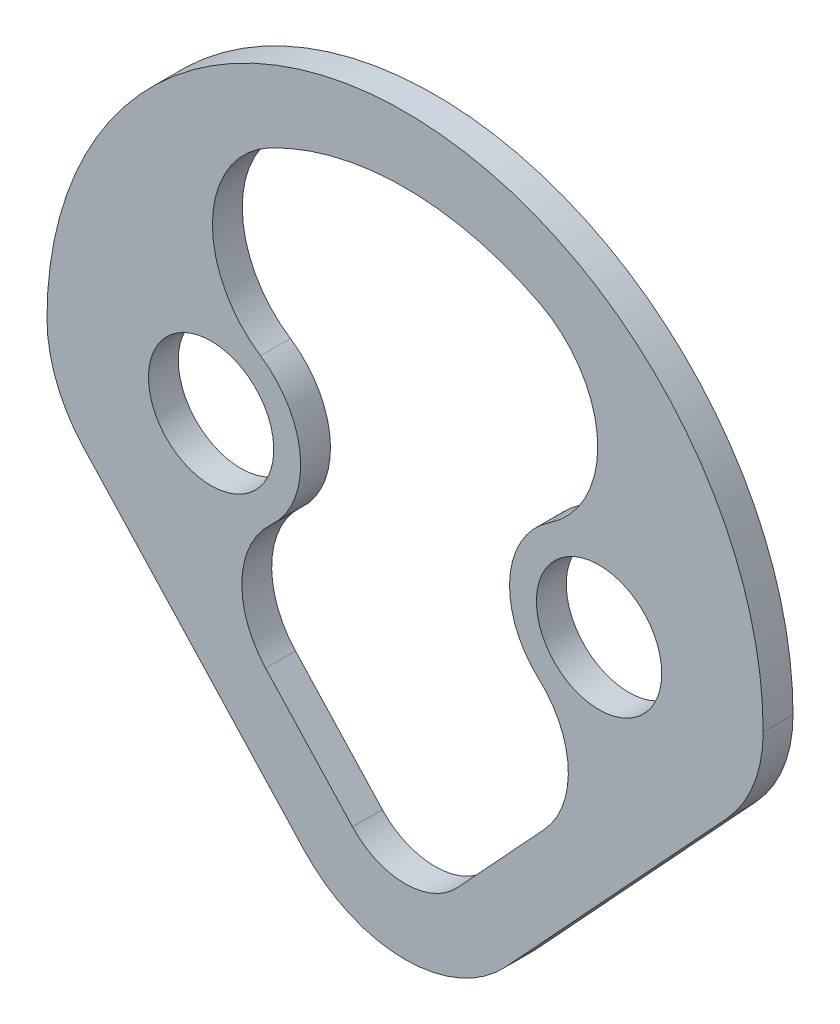
ISO-10303-21;
HEADER;
FILE_DESCRIPTION(('STEP AP214'),'2;1');
FILE_NAME('part.step','',(''),(''),'','','');
FILE_SCHEMA(('AUTOMOTIVE_DESIGN { 1 0 10303 214 1 1 1 1 }'));
ENDSEC;
DATA;
#1=APPLICATION_CONTEXT('core data for automotive mechanical design processes');
#2=APPLICATION_PROTOCOL_DEFINITION('international standard','automotive_design',2000,#1);
#3=PRODUCT_CONTEXT('',#1,'mechanical');
#4=PRODUCT('Part','Part','',(#3));
#5=PRODUCT_RELATED_PRODUCT_CATEGORY('part','',(#4));
#6=PRODUCT_DEFINITION_FORMATION('','',#4);
#7=PRODUCT_DEFINITION_CONTEXT('part definition',#1,'design');
#8=PRODUCT_DEFINITION('design','',#6,#7);
#9=PRODUCT_DEFINITION_SHAPE('','',#8);
#10=(LENGTH_UNIT() NAMED_UNIT(*) SI_UNIT(.MILLI.,.METRE.));
#11=(NAMED_UNIT(*) PLANE_ANGLE_UNIT() SI_UNIT($,.RADIAN.));
#12=(NAMED_UNIT(*) SI_UNIT($,.STERADIAN.) SOLID_ANGLE_UNIT());
#13=UNCERTAINTY_MEASURE_WITH_UNIT(LENGTH_MEASURE(1.E-05),#10,'distance_accuracy_value','');
#14=(GEOMETRIC_REPRESENTATION_CONTEXT(3) GLOBAL_UNCERTAINTY_ASSIGNED_CONTEXT((#13)) GLOBAL_UNIT_ASSIGNED_CONTEXT((#10,
#11,#12)) REPRESENTATION_CONTEXT('',''));
#15=CARTESIAN_POINT('',(0.,0.,0.));
#16=DIRECTION('',(0.,0.,1.));
#17=DIRECTION('',(1.,0.,0.));
#18=AXIS2_PLACEMENT_3D('',#15,#16,#17);
#19=CARTESIAN_POINT('',(0.,0.,5.));
#20=DIRECTION('',(0.,0.,1.));
#21=DIRECTION('',(1.,0.,0.));
#22=AXIS2_PLACEMENT_3D('',#19,#20,#21);
#23=PLANE('',#22);
#24=CARTESIAN_POINT('',(32.5,40.,5.));
#25=DIRECTION('',(0.,0.,1.));
#26=DIRECTION('',(1.,0.,0.));
#27=AXIS2_PLACEMENT_3D('',#24,#25,#26);
#28=CIRCLE('',#27,10.5);
#29=CARTESIAN_POINT('',(43.,40.,5.));
#30=VERTEX_POINT('',#29);
#31=EDGE_CURVE('E191',#30,#30,#28,.T.);
#32=ORIENTED_EDGE('',*,*,#31,.F.);
#33=EDGE_LOOP('',(#32));
#34=FACE_BOUND('',#33,.T.);
#35=CARTESIAN_POINT('',(0.,0.,5.));
#36=DIRECTION('',(0.,0.,1.));
#37=DIRECTION('',(1.,0.,0.));
#38=AXIS2_PLACEMENT_3D('',#35,#36,#37);
#39=CIRCLE('',#38,23.);
#40=CARTESIAN_POINT('',(-16.8842871104874,-15.6179655772008,5.));
#41=VERTEX_POINT('',#40);
#42=CARTESIAN_POINT('',(16.8842871104874,-15.6179655772008,5.));
#43=VERTEX_POINT('',#42);
#44=EDGE_CURVE('E233',#41,#43,#39,.T.);
#45=ORIENTED_EDGE('',*,*,#44,.T.);
#46=DIRECTION('',(0.679041981617427,0.734099439586408,0.));
#47=VECTOR('',#46,1.);
#48=CARTESIAN_POINT('',(53.8842871104874,24.3820344227992,5.));
#49=LINE('',#48,#47);
#50=CARTESIAN_POINT('',(53.8842871104874,24.3820344227992,5.));
#51=VERTEX_POINT('',#50);
#52=EDGE_CURVE('E240',#43,#51,#49,.T.);
#53=ORIENTED_EDGE('',*,*,#52,.T.);
#54=CARTESIAN_POINT('',(37.,40.,5.));
#55=DIRECTION('',(0.,0.,1.));
#56=DIRECTION('',(-1.,0.,0.));
#57=AXIS2_PLACEMENT_3D('',#54,#55,#56);
#58=CIRCLE('',#57,23.);
#59=CARTESIAN_POINT('',(60.,40.,5.));
#60=VERTEX_POINT('',#59);
#61=EDGE_CURVE('E238',#51,#60,#58,.T.);
#62=ORIENTED_EDGE('',*,*,#61,.T.);
#63=CARTESIAN_POINT('',(0.,40.,5.));
#64=DIRECTION('',(0.,0.,1.));
#65=DIRECTION('',(-1.,0.,0.));
#66=AXIS2_PLACEMENT_3D('',#63,#64,#65);
#67=CIRCLE('',#66,60.);
#68=CARTESIAN_POINT('',(-60.,40.,5.));
#69=VERTEX_POINT('',#68);
#70=EDGE_CURVE('E242',#60,#69,#67,.T.);
#71=ORIENTED_EDGE('',*,*,#70,.T.);
#72=CARTESIAN_POINT('',(-37.,40.,5.));
#73=DIRECTION('',(0.,0.,1.));
#74=DIRECTION('',(1.,0.,0.));
#75=AXIS2_PLACEMENT_3D('',#72,#73,#74);
#76=CIRCLE('',#75,23.);
#77=CARTESIAN_POINT('',(-53.8842871104874,24.3820344227992,5.));
#78=VERTEX_POINT('',#77);
#79=EDGE_CURVE('E243',#69,#78,#76,.T.);
#80=ORIENTED_EDGE('',*,*,#79,.T.);
#81=DIRECTION('',(0.679041981617427,-0.734099439586408,0.));
#82=VECTOR('',#81,1.);
#83=CARTESIAN_POINT('',(-53.8842871104874,24.3820344227992,5.));
#84=LINE('',#83,#82);
#85=EDGE_CURVE('E247',#78,#41,#84,.T.);
#86=ORIENTED_EDGE('',*,*,#85,.T.);
#87=EDGE_LOOP('',(#45,#53,#62,#71,#80,#86));
#88=FACE_BOUND('',#87,.T.);
#89=CARTESIAN_POINT('',(32.5,40.,5.));
#90=DIRECTION('',(0.,0.,-1.));
#91=DIRECTION('',(1.,0.,0.));
#92=AXIS2_PLACEMENT_3D('',#89,#90,#91);
#93=CIRCLE('',#92,15.);
#94=CARTESIAN_POINT('',(22.4262716545417,28.8860449334222,5.));
#95=VERTEX_POINT('',#94);
#96=CARTESIAN_POINT('',(24.2185314685315,52.5066893685858,5.));
#97=VERTEX_POINT('',#96);
#98=EDGE_CURVE('E158',#95,#97,#93,.T.);
#99=ORIENTED_EDGE('',*,*,#98,.F.);
#100=CARTESIAN_POINT('',(12.3525433090835,17.7720898668444,5.));
#101=DIRECTION('',(0.,0.,1.));
#102=DIRECTION('',(1.,0.,0.));
#103=AXIS2_PLACEMENT_3D('',#100,#101,#102);
#104=CIRCLE('',#103,15.);
#105=CARTESIAN_POINT('',(23.3640349028796,7.58646014258298,5.));
#106=VERTEX_POINT('',#105);
#107=EDGE_CURVE('E152',#106,#95,#104,.T.);
#108=ORIENTED_EDGE('',*,*,#107,.F.);
#109=DIRECTION('',(0.679041981617427,0.734099439586408,0.));
#110=VECTOR('',#109,1.);
#111=CARTESIAN_POINT('',(8.8091932750369,-8.14850377940912,5.));
#112=LINE('',#111,#110);
#113=CARTESIAN_POINT('',(8.8091932750369,-8.14850377940912,5.));
#114=VERTEX_POINT('',#113);
#115=EDGE_CURVE('E192',#114,#106,#112,.T.);
#116=ORIENTED_EDGE('',*,*,#115,.F.);
#117=CARTESIAN_POINT('',(0.,0.,5.));
#118=DIRECTION('',(0.,0.,1.));
#119=DIRECTION('',(1.,0.,0.));
#120=AXIS2_PLACEMENT_3D('',#117,#118,#119);
#121=CIRCLE('',#120,12.);
#122=CARTESIAN_POINT('',(-8.8091932750369,-8.14850377940912,5.));
#123=VERTEX_POINT('',#122);
#124=EDGE_CURVE('E188',#123,#114,#121,.T.);
#125=ORIENTED_EDGE('',*,*,#124,.F.);
#126=DIRECTION('',(0.679041981617427,-0.734099439586408,0.));
#127=VECTOR('',#126,1.);
#128=CARTESIAN_POINT('',(-8.8091932750369,-8.14850377940912,5.));
#129=LINE('',#128,#127);
#130=CARTESIAN_POINT('',(-23.3640349028796,7.58646014258298,5.));
#131=VERTEX_POINT('',#130);
#132=EDGE_CURVE('E190',#131,#123,#129,.T.);
#133=ORIENTED_EDGE('',*,*,#132,.F.);
#134=CARTESIAN_POINT('',(-12.3525433090835,17.7720898668444,5.));
#135=DIRECTION('',(0.,0.,1.));
#136=DIRECTION('',(-1.,0.,0.));
#137=AXIS2_PLACEMENT_3D('',#134,#135,#136);
#138=CIRCLE('',#137,15.);
#139=CARTESIAN_POINT('',(-22.4262716545417,28.8860449334222,5.));
#140=VERTEX_POINT('',#139);
#141=EDGE_CURVE('E184',#140,#131,#138,.T.);
#142=ORIENTED_EDGE('',*,*,#141,.F.);
#143=CARTESIAN_POINT('',(-32.5,40.,5.));
#144=DIRECTION('',(0.,0.,-1.));
#145=DIRECTION('',(-1.,0.,0.));
#146=AXIS2_PLACEMENT_3D('',#143,#144,#145);
#147=CIRCLE('',#146,15.);
#148=CARTESIAN_POINT('',(-24.2185314685315,52.5066893685858,5.));
#149=VERTEX_POINT('',#148);
#150=EDGE_CURVE('E183',#149,#140,#147,.T.);
#151=ORIENTED_EDGE('',*,*,#150,.F.);
#152=CARTESIAN_POINT('',(-14.2807692307692,67.5147166108887,5.));
#153=DIRECTION('',(0.,0.,1.));
#154=DIRECTION('',(1.,0.,0.));
#155=AXIS2_PLACEMENT_3D('',#152,#153,#154);
#156=CIRCLE('',#155,18.);
#157=CARTESIAN_POINT('',(-22.5728287841191,83.4910036752757,5.));
#158=VERTEX_POINT('',#157);
#159=EDGE_CURVE('E181',#158,#149,#156,.T.);
#160=ORIENTED_EDGE('',*,*,#159,.F.);
#161=CARTESIAN_POINT('',(0.,40.,5.));
#162=DIRECTION('',(0.,0.,1.));
#163=DIRECTION('',(-1.,0.,0.));
#164=AXIS2_PLACEMENT_3D('',#161,#162,#163);
#165=CIRCLE('',#164,49.);
#166=CARTESIAN_POINT('',(22.5728287841191,83.4910036752757,5.));
#167=VERTEX_POINT('',#166);
#168=EDGE_CURVE('E176',#167,#158,#165,.T.);
#169=ORIENTED_EDGE('',*,*,#168,.F.);
#170=CARTESIAN_POINT('',(14.2807692307692,67.5147166108887,5.));
#171=DIRECTION('',(0.,0.,1.));
#172=DIRECTION('',(-1.,0.,0.));
#173=AXIS2_PLACEMENT_3D('',#170,#171,#172);
#174=CIRCLE('',#173,18.);
#175=EDGE_CURVE('E174',#97,#167,#174,.T.);
#176=ORIENTED_EDGE('',*,*,#175,.F.);
#177=EDGE_LOOP('',(#99,#108,#116,#125,#133,#142,#151,#160,#169,#176));
#178=FACE_BOUND('',#177,.T.);
#179=CARTESIAN_POINT('',(-32.5,40.,5.));
#180=DIRECTION('',(0.,0.,1.));
#181=DIRECTION('',(-1.,0.,0.));
#182=AXIS2_PLACEMENT_3D('',#179,#180,#181);
#183=CIRCLE('',#182,10.5);
#184=CARTESIAN_POINT('',(-43.,40.,5.));
#185=VERTEX_POINT('',#184);
#186=EDGE_CURVE('E362',#185,#185,#183,.T.);
#187=ORIENTED_EDGE('',*,*,#186,.F.);
#188=EDGE_LOOP('',(#187));
#189=FACE_BOUND('',#188,.T.);
#190=ADVANCED_FACE('F39',(#34,#88,#178,#189),#23,.T.);
#191=CARTESIAN_POINT('',(0.,0.,0.));
#192=DIRECTION('',(0.,0.,1.));
#193=DIRECTION('',(1.,0.,0.));
#194=AXIS2_PLACEMENT_3D('',#191,#192,#193);
#195=PLANE('',#194);
#196=CARTESIAN_POINT('',(0.,0.,0.));
#197=DIRECTION('',(0.,0.,1.));
#198=DIRECTION('',(1.,0.,0.));
#199=AXIS2_PLACEMENT_3D('',#196,#197,#198);
#200=CIRCLE('',#199,23.);
#201=CARTESIAN_POINT('',(-16.8842871104874,-15.6179655772008,0.));
#202=VERTEX_POINT('',#201);
#203=CARTESIAN_POINT('',(16.8842871104874,-15.6179655772008,0.));
#204=VERTEX_POINT('',#203);
#205=EDGE_CURVE('E166',#202,#204,#200,.T.);
#206=ORIENTED_EDGE('',*,*,#205,.F.);
#207=DIRECTION('',(0.679041981617427,-0.734099439586408,0.));
#208=VECTOR('',#207,1.);
#209=CARTESIAN_POINT('',(-53.8842871104874,24.3820344227992,0.));
#210=LINE('',#209,#208);
#211=CARTESIAN_POINT('',(-53.8842871104874,24.3820344227992,0.));
#212=VERTEX_POINT('',#211);
#213=EDGE_CURVE('E239',#212,#202,#210,.T.);
#214=ORIENTED_EDGE('',*,*,#213,.F.);
#215=CARTESIAN_POINT('',(-37.,40.,0.));
#216=DIRECTION('',(0.,0.,1.));
#217=DIRECTION('',(1.,0.,0.));
#218=AXIS2_PLACEMENT_3D('',#215,#216,#217);
#219=CIRCLE('',#218,23.);
#220=CARTESIAN_POINT('',(-60.,40.,0.));
#221=VERTEX_POINT('',#220);
#222=EDGE_CURVE('E257',#221,#212,#219,.T.);
#223=ORIENTED_EDGE('',*,*,#222,.F.);
#224=CARTESIAN_POINT('',(0.,40.,0.));
#225=DIRECTION('',(0.,0.,1.));
#226=DIRECTION('',(-1.,0.,0.));
#227=AXIS2_PLACEMENT_3D('',#224,#225,#226);
#228=CIRCLE('',#227,60.);
#229=CARTESIAN_POINT('',(60.,40.,0.));
#230=VERTEX_POINT('',#229);
#231=EDGE_CURVE('E255',#230,#221,#228,.T.);
#232=ORIENTED_EDGE('',*,*,#231,.F.);
#233=CARTESIAN_POINT('',(37.,40.,0.));
#234=DIRECTION('',(0.,0.,1.));
#235=DIRECTION('',(-1.,0.,0.));
#236=AXIS2_PLACEMENT_3D('',#233,#234,#235);
#237=CIRCLE('',#236,23.);
#238=CARTESIAN_POINT('',(53.8842871104874,24.3820344227992,0.));
#239=VERTEX_POINT('',#238);
#240=EDGE_CURVE('E254',#239,#230,#237,.T.);
#241=ORIENTED_EDGE('',*,*,#240,.F.);
#242=DIRECTION('',(0.679041981617427,0.734099439586408,0.));
#243=VECTOR('',#242,1.);
#244=CARTESIAN_POINT('',(53.8842871104874,24.3820344227992,0.));
#245=LINE('',#244,#243);
#246=EDGE_CURVE('E251',#204,#239,#245,.T.);
#247=ORIENTED_EDGE('',*,*,#246,.F.);
#248=EDGE_LOOP('',(#206,#214,#223,#232,#241,#247));
#249=FACE_BOUND('',#248,.T.);
#250=CARTESIAN_POINT('',(12.3525433090835,17.7720898668444,0.));
#251=DIRECTION('',(0.,0.,1.));
#252=DIRECTION('',(1.,0.,0.));
#253=AXIS2_PLACEMENT_3D('',#250,#251,#252);
#254=CIRCLE('',#253,15.);
#255=CARTESIAN_POINT('',(23.3640349028796,7.58646014258298,0.));
#256=VERTEX_POINT('',#255);
#257=CARTESIAN_POINT('',(22.4262716545417,28.8860449334222,0.));
#258=VERTEX_POINT('',#257);
#259=EDGE_CURVE('E62',#256,#258,#254,.T.);
#260=ORIENTED_EDGE('',*,*,#259,.T.);
#261=CARTESIAN_POINT('',(32.5,40.,0.));
#262=DIRECTION('',(0.,0.,-1.));
#263=DIRECTION('',(1.,0.,0.));
#264=AXIS2_PLACEMENT_3D('',#261,#262,#263);
#265=CIRCLE('',#264,15.);
#266=CARTESIAN_POINT('',(24.2185314685315,52.5066893685858,0.));
#267=VERTEX_POINT('',#266);
#268=EDGE_CURVE('E167',#258,#267,#265,.T.);
#269=ORIENTED_EDGE('',*,*,#268,.T.);
#270=CARTESIAN_POINT('',(14.2807692307692,67.5147166108887,0.));
#271=DIRECTION('',(0.,0.,1.));
#272=DIRECTION('',(-1.,0.,0.));
#273=AXIS2_PLACEMENT_3D('',#270,#271,#272);
#274=CIRCLE('',#273,18.);
#275=CARTESIAN_POINT('',(22.5728287841191,83.4910036752757,0.));
#276=VERTEX_POINT('',#275);
#277=EDGE_CURVE('E196',#267,#276,#274,.T.);
#278=ORIENTED_EDGE('',*,*,#277,.T.);
#279=CARTESIAN_POINT('',(0.,40.,0.));
#280=DIRECTION('',(0.,0.,1.));
#281=DIRECTION('',(-1.,0.,0.));
#282=AXIS2_PLACEMENT_3D('',#279,#280,#281);
#283=CIRCLE('',#282,49.);
#284=CARTESIAN_POINT('',(-22.5728287841191,83.4910036752757,0.));
#285=VERTEX_POINT('',#284);
#286=EDGE_CURVE('E198',#276,#285,#283,.T.);
#287=ORIENTED_EDGE('',*,*,#286,.T.);
#288=CARTESIAN_POINT('',(-14.2807692307692,67.5147166108887,0.));
#289=DIRECTION('',(0.,0.,1.));
#290=DIRECTION('',(1.,0.,0.));
#291=AXIS2_PLACEMENT_3D('',#288,#289,#290);
#292=CIRCLE('',#291,18.);
#293=CARTESIAN_POINT('',(-24.2185314685315,52.5066893685858,0.));
#294=VERTEX_POINT('',#293);
#295=EDGE_CURVE('E205',#285,#294,#292,.T.);
#296=ORIENTED_EDGE('',*,*,#295,.T.);
#297=CARTESIAN_POINT('',(-32.5,40.,0.));
#298=DIRECTION('',(0.,0.,-1.));
#299=DIRECTION('',(-1.,0.,0.));
#300=AXIS2_PLACEMENT_3D('',#297,#298,#299);
#301=CIRCLE('',#300,15.);
#302=CARTESIAN_POINT('',(-22.4262716545417,28.8860449334222,0.));
#303=VERTEX_POINT('',#302);
#304=EDGE_CURVE('E203',#294,#303,#301,.T.);
#305=ORIENTED_EDGE('',*,*,#304,.T.);
#306=CARTESIAN_POINT('',(-12.3525433090835,17.7720898668444,0.));
#307=DIRECTION('',(0.,0.,1.));
#308=DIRECTION('',(-1.,0.,0.));
#309=AXIS2_PLACEMENT_3D('',#306,#307,#308);
#310=CIRCLE('',#309,15.);
#311=CARTESIAN_POINT('',(-23.3640349028796,7.58646014258298,0.));
#312=VERTEX_POINT('',#311);
#313=EDGE_CURVE('E209',#303,#312,#310,.T.);
#314=ORIENTED_EDGE('',*,*,#313,.T.);
#315=DIRECTION('',(0.679041981617427,-0.734099439586408,0.));
#316=VECTOR('',#315,1.);
#317=CARTESIAN_POINT('',(-8.8091932750369,-8.14850377940912,0.));
#318=LINE('',#317,#316);
#319=CARTESIAN_POINT('',(-8.8091932750369,-8.14850377940912,0.));
#320=VERTEX_POINT('',#319);
#321=EDGE_CURVE('E213',#312,#320,#318,.T.);
#322=ORIENTED_EDGE('',*,*,#321,.T.);
#323=CARTESIAN_POINT('',(0.,0.,0.));
#324=DIRECTION('',(0.,0.,1.));
#325=DIRECTION('',(1.,0.,0.));
#326=AXIS2_PLACEMENT_3D('',#323,#324,#325);
#327=CIRCLE('',#326,12.);
#328=CARTESIAN_POINT('',(8.8091932750369,-8.14850377940912,0.));
#329=VERTEX_POINT('',#328);
#330=EDGE_CURVE('E215',#320,#329,#327,.T.);
#331=ORIENTED_EDGE('',*,*,#330,.T.);
#332=DIRECTION('',(0.679041981617427,0.734099439586408,0.));
#333=VECTOR('',#332,1.);
#334=CARTESIAN_POINT('',(8.8091932750369,-8.14850377940912,0.));
#335=LINE('',#334,#333);
#336=EDGE_CURVE('E161',#329,#256,#335,.T.);
#337=ORIENTED_EDGE('',*,*,#336,.T.);
#338=EDGE_LOOP('',(#260,#269,#278,#287,#296,#305,#314,#322,#331,#337));
#339=FACE_BOUND('',#338,.T.);
#340=CARTESIAN_POINT('',(32.5,40.,0.));
#341=DIRECTION('',(0.,0.,1.));
#342=DIRECTION('',(1.,0.,0.));
#343=AXIS2_PLACEMENT_3D('',#340,#341,#342);
#344=CIRCLE('',#343,10.5);
#345=CARTESIAN_POINT('',(43.,40.,0.));
#346=VERTEX_POINT('',#345);
#347=EDGE_CURVE('E369',#346,#346,#344,.T.);
#348=ORIENTED_EDGE('',*,*,#347,.T.);
#349=EDGE_LOOP('',(#348));
#350=FACE_BOUND('',#349,.T.);
#351=CARTESIAN_POINT('',(-32.5,40.,0.));
#352=DIRECTION('',(0.,0.,1.));
#353=DIRECTION('',(-1.,0.,0.));
#354=AXIS2_PLACEMENT_3D('',#351,#352,#353);
#355=CIRCLE('',#354,10.5);
#356=CARTESIAN_POINT('',(-43.,40.,0.));
#357=VERTEX_POINT('',#356);
#358=EDGE_CURVE('E370',#357,#357,#355,.T.);
#359=ORIENTED_EDGE('',*,*,#358,.T.);
#360=EDGE_LOOP('',(#359));
#361=FACE_BOUND('',#360,.T.);
#362=ADVANCED_FACE('F282',(#249,#339,#350,#361),#195,.F.);
#363=CARTESIAN_POINT('',(0.,0.,5.));
#364=DIRECTION('',(0.,0.,-1.));
#365=DIRECTION('',(-1.,0.,0.));
#366=AXIS2_PLACEMENT_3D('',#363,#364,#365);
#367=CYLINDRICAL_SURFACE('',#366,23.);
#368=ORIENTED_EDGE('',*,*,#205,.T.);
#369=DIRECTION('',(0.,0.,-1.));
#370=VECTOR('',#369,1.);
#371=CARTESIAN_POINT('',(16.8842871104874,-15.6179655772008,5.));
#372=LINE('',#371,#370);
#373=EDGE_CURVE('E11',#43,#204,#372,.T.);
#374=ORIENTED_EDGE('',*,*,#373,.F.);
#375=ORIENTED_EDGE('',*,*,#44,.F.);
#376=DIRECTION('',(0.,0.,-1.));
#377=VECTOR('',#376,1.);
#378=CARTESIAN_POINT('',(-16.8842871104874,-15.6179655772008,5.));
#379=LINE('',#378,#377);
#380=EDGE_CURVE('E246',#41,#202,#379,.T.);
#381=ORIENTED_EDGE('',*,*,#380,.T.);
#382=EDGE_LOOP('',(#368,#374,#375,#381));
#383=FACE_BOUND('',#382,.T.);
#384=ADVANCED_FACE('F41',(#383),#367,.T.);
#385=CARTESIAN_POINT('',(53.8842871104874,24.3820344227992,5.));
#386=DIRECTION('',(-0.734099439586408,0.679041981617427,0.));
#387=DIRECTION('',(-0.679041981617427,-0.734099439586408,0.));
#388=AXIS2_PLACEMENT_3D('',#385,#386,#387);
#389=PLANE('',#388);
#390=ORIENTED_EDGE('',*,*,#246,.T.);
#391=DIRECTION('',(0.,0.,-1.));
#392=VECTOR('',#391,1.);
#393=CARTESIAN_POINT('',(53.8842871104874,24.3820344227992,5.));
#394=LINE('',#393,#392);
#395=EDGE_CURVE('E50',#51,#239,#394,.T.);
#396=ORIENTED_EDGE('',*,*,#395,.F.);
#397=ORIENTED_EDGE('',*,*,#52,.F.);
#398=ORIENTED_EDGE('',*,*,#373,.T.);
#399=EDGE_LOOP('',(#390,#396,#397,#398));
#400=FACE_BOUND('',#399,.T.);
#401=ADVANCED_FACE('F299',(#400),#389,.F.);
#402=CARTESIAN_POINT('',(37.,40.,5.));
#403=DIRECTION('',(0.,0.,-1.));
#404=DIRECTION('',(-1.,0.,0.));
#405=AXIS2_PLACEMENT_3D('',#402,#403,#404);
#406=CYLINDRICAL_SURFACE('',#405,23.);
#407=ORIENTED_EDGE('',*,*,#240,.T.);
#408=DIRECTION('',(0.,0.,-1.));
#409=VECTOR('',#408,1.);
#410=CARTESIAN_POINT('',(60.,40.,5.));
#411=LINE('',#410,#409);
#412=EDGE_CURVE('E268',#60,#230,#411,.T.);
#413=ORIENTED_EDGE('',*,*,#412,.F.);
#414=ORIENTED_EDGE('',*,*,#61,.F.);
#415=ORIENTED_EDGE('',*,*,#395,.T.);
#416=EDGE_LOOP('',(#407,#413,#414,#415));
#417=FACE_BOUND('',#416,.T.);
#418=ADVANCED_FACE('F274',(#417),#406,.T.);
#419=CARTESIAN_POINT('',(0.,40.,5.));
#420=DIRECTION('',(0.,0.,-1.));
#421=DIRECTION('',(-1.,0.,0.));
#422=AXIS2_PLACEMENT_3D('',#419,#420,#421);
#423=CYLINDRICAL_SURFACE('',#422,60.);
#424=ORIENTED_EDGE('',*,*,#231,.T.);
#425=DIRECTION('',(0.,0.,-1.));
#426=VECTOR('',#425,1.);
#427=CARTESIAN_POINT('',(-60.,40.,5.));
#428=LINE('',#427,#426);
#429=EDGE_CURVE('E262',#69,#221,#428,.T.);
#430=ORIENTED_EDGE('',*,*,#429,.F.);
#431=ORIENTED_EDGE('',*,*,#70,.F.);
#432=ORIENTED_EDGE('',*,*,#412,.T.);
#433=EDGE_LOOP('',(#424,#430,#431,#432));
#434=FACE_BOUND('',#433,.T.);
#435=ADVANCED_FACE('F287',(#434),#423,.T.);
#436=CARTESIAN_POINT('',(-37.,40.,5.));
#437=DIRECTION('',(0.,0.,-1.));
#438=DIRECTION('',(-1.,0.,0.));
#439=AXIS2_PLACEMENT_3D('',#436,#437,#438);
#440=CYLINDRICAL_SURFACE('',#439,23.);
#441=ORIENTED_EDGE('',*,*,#222,.T.);
#442=DIRECTION('',(0.,0.,-1.));
#443=VECTOR('',#442,1.);
#444=CARTESIAN_POINT('',(-53.8842871104874,24.3820344227992,5.));
#445=LINE('',#444,#443);
#446=EDGE_CURVE('E265',#78,#212,#445,.T.);
#447=ORIENTED_EDGE('',*,*,#446,.F.);
#448=ORIENTED_EDGE('',*,*,#79,.F.);
#449=ORIENTED_EDGE('',*,*,#429,.T.);
#450=EDGE_LOOP('',(#441,#447,#448,#449));
#451=FACE_BOUND('',#450,.T.);
#452=ADVANCED_FACE('F292',(#451),#440,.T.);
#453=CARTESIAN_POINT('',(-53.8842871104874,24.3820344227992,5.));
#454=DIRECTION('',(0.734099439586408,0.679041981617427,0.));
#455=DIRECTION('',(-0.679041981617427,0.734099439586408,0.));
#456=AXIS2_PLACEMENT_3D('',#453,#454,#455);
#457=PLANE('',#456);
#458=ORIENTED_EDGE('',*,*,#213,.T.);
#459=ORIENTED_EDGE('',*,*,#380,.F.);
#460=ORIENTED_EDGE('',*,*,#85,.F.);
#461=ORIENTED_EDGE('',*,*,#446,.T.);
#462=EDGE_LOOP('',(#458,#459,#460,#461));
#463=FACE_BOUND('',#462,.T.);
#464=ADVANCED_FACE('F303',(#463),#457,.F.);
#465=CARTESIAN_POINT('',(12.3525433090835,17.7720898668444,5.));
#466=DIRECTION('',(0.,0.,-1.));
#467=DIRECTION('',(-1.,0.,0.));
#468=AXIS2_PLACEMENT_3D('',#465,#466,#467);
#469=CYLINDRICAL_SURFACE('',#468,15.);
#470=ORIENTED_EDGE('',*,*,#259,.F.);
#471=DIRECTION('',(0.,0.,-1.));
#472=VECTOR('',#471,1.);
#473=CARTESIAN_POINT('',(23.3640349028796,7.58646014258298,5.));
#474=LINE('',#473,#472);
#475=EDGE_CURVE('E157',#106,#256,#474,.T.);
#476=ORIENTED_EDGE('',*,*,#475,.F.);
#477=ORIENTED_EDGE('',*,*,#107,.T.);
#478=DIRECTION('',(0.,0.,-1.));
#479=VECTOR('',#478,1.);
#480=CARTESIAN_POINT('',(22.4262716545417,28.8860449334222,5.));
#481=LINE('',#480,#479);
#482=EDGE_CURVE('E155',#95,#258,#481,.T.);
#483=ORIENTED_EDGE('',*,*,#482,.T.);
#484=EDGE_LOOP('',(#470,#476,#477,#483));
#485=FACE_BOUND('',#484,.T.);
#486=ADVANCED_FACE('F153',(#485),#469,.F.);
#487=CARTESIAN_POINT('',(32.5,40.,5.));
#488=DIRECTION('',(0.,0.,-1.));
#489=DIRECTION('',(-1.,0.,0.));
#490=AXIS2_PLACEMENT_3D('',#487,#488,#489);
#491=CYLINDRICAL_SURFACE('',#490,15.);
#492=ORIENTED_EDGE('',*,*,#268,.F.);
#493=ORIENTED_EDGE('',*,*,#482,.F.);
#494=ORIENTED_EDGE('',*,*,#98,.T.);
#495=DIRECTION('',(0.,0.,-1.));
#496=VECTOR('',#495,1.);
#497=CARTESIAN_POINT('',(24.2185314685315,52.5066893685858,5.));
#498=LINE('',#497,#496);
#499=EDGE_CURVE('E170',#97,#267,#498,.T.);
#500=ORIENTED_EDGE('',*,*,#499,.T.);
#501=EDGE_LOOP('',(#492,#493,#494,#500));
#502=FACE_BOUND('',#501,.T.);
#503=ADVANCED_FACE('F163',(#502),#491,.T.);
#504=CARTESIAN_POINT('',(14.2807692307692,67.5147166108887,5.));
#505=DIRECTION('',(0.,0.,-1.));
#506=DIRECTION('',(-1.,0.,0.));
#507=AXIS2_PLACEMENT_3D('',#504,#505,#506);
#508=CYLINDRICAL_SURFACE('',#507,18.);
#509=ORIENTED_EDGE('',*,*,#277,.F.);
#510=ORIENTED_EDGE('',*,*,#499,.F.);
#511=ORIENTED_EDGE('',*,*,#175,.T.);
#512=DIRECTION('',(0.,0.,-1.));
#513=VECTOR('',#512,1.);
#514=CARTESIAN_POINT('',(22.5728287841191,83.4910036752757,5.));
#515=LINE('',#514,#513);
#516=EDGE_CURVE('E231',#167,#276,#515,.T.);
#517=ORIENTED_EDGE('',*,*,#516,.T.);
#518=EDGE_LOOP('',(#509,#510,#511,#517));
#519=FACE_BOUND('',#518,.T.);
#520=ADVANCED_FACE('F321',(#519),#508,.F.);
#521=CARTESIAN_POINT('',(0.,40.,5.));
#522=DIRECTION('',(0.,0.,-1.));
#523=DIRECTION('',(-1.,0.,0.));
#524=AXIS2_PLACEMENT_3D('',#521,#522,#523);
#525=CYLINDRICAL_SURFACE('',#524,49.);
#526=ORIENTED_EDGE('',*,*,#286,.F.);
#527=ORIENTED_EDGE('',*,*,#516,.F.);
#528=ORIENTED_EDGE('',*,*,#168,.T.);
#529=DIRECTION('',(0.,0.,-1.));
#530=VECTOR('',#529,1.);
#531=CARTESIAN_POINT('',(-22.5728287841191,83.4910036752757,5.));
#532=LINE('',#531,#530);
#533=EDGE_CURVE('E227',#158,#285,#532,.T.);
#534=ORIENTED_EDGE('',*,*,#533,.T.);
#535=EDGE_LOOP('',(#526,#527,#528,#534));
#536=FACE_BOUND('',#535,.T.);
#537=ADVANCED_FACE('F323',(#536),#525,.F.);
#538=CARTESIAN_POINT('',(-14.2807692307692,67.5147166108887,5.));
#539=DIRECTION('',(0.,0.,-1.));
#540=DIRECTION('',(-1.,0.,0.));
#541=AXIS2_PLACEMENT_3D('',#538,#539,#540);
#542=CYLINDRICAL_SURFACE('',#541,18.);
#543=ORIENTED_EDGE('',*,*,#295,.F.);
#544=ORIENTED_EDGE('',*,*,#533,.F.);
#545=ORIENTED_EDGE('',*,*,#159,.T.);
#546=DIRECTION('',(0.,0.,-1.));
#547=VECTOR('',#546,1.);
#548=CARTESIAN_POINT('',(-24.2185314685315,52.5066893685858,5.));
#549=LINE('',#548,#547);
#550=EDGE_CURVE('E230',#149,#294,#549,.T.);
#551=ORIENTED_EDGE('',*,*,#550,.T.);
#552=EDGE_LOOP('',(#543,#544,#545,#551));
#553=FACE_BOUND('',#552,.T.);
#554=ADVANCED_FACE('F329',(#553),#542,.F.);
#555=CARTESIAN_POINT('',(-32.5,40.,5.));
#556=DIRECTION('',(0.,0.,-1.));
#557=DIRECTION('',(-1.,0.,0.));
#558=AXIS2_PLACEMENT_3D('',#555,#556,#557);
#559=CYLINDRICAL_SURFACE('',#558,15.);
#560=ORIENTED_EDGE('',*,*,#304,.F.);
#561=ORIENTED_EDGE('',*,*,#550,.F.);
#562=ORIENTED_EDGE('',*,*,#150,.T.);
#563=DIRECTION('',(0.,0.,-1.));
#564=VECTOR('',#563,1.);
#565=CARTESIAN_POINT('',(-22.4262716545417,28.8860449334222,5.));
#566=LINE('',#565,#564);
#567=EDGE_CURVE('E224',#140,#303,#566,.T.);
#568=ORIENTED_EDGE('',*,*,#567,.T.);
#569=EDGE_LOOP('',(#560,#561,#562,#568));
#570=FACE_BOUND('',#569,.T.);
#571=ADVANCED_FACE('F332',(#570),#559,.T.);
#572=CARTESIAN_POINT('',(-12.3525433090835,17.7720898668444,5.));
#573=DIRECTION('',(0.,0.,-1.));
#574=DIRECTION('',(-1.,0.,0.));
#575=AXIS2_PLACEMENT_3D('',#572,#573,#574);
#576=CYLINDRICAL_SURFACE('',#575,15.);
#577=ORIENTED_EDGE('',*,*,#313,.F.);
#578=ORIENTED_EDGE('',*,*,#567,.F.);
#579=ORIENTED_EDGE('',*,*,#141,.T.);
#580=DIRECTION('',(0.,0.,-1.));
#581=VECTOR('',#580,1.);
#582=CARTESIAN_POINT('',(-23.3640349028796,7.58646014258298,5.));
#583=LINE('',#582,#581);
#584=EDGE_CURVE('E223',#131,#312,#583,.T.);
#585=ORIENTED_EDGE('',*,*,#584,.T.);
#586=EDGE_LOOP('',(#577,#578,#579,#585));
#587=FACE_BOUND('',#586,.T.);
#588=ADVANCED_FACE('F337',(#587),#576,.F.);
#589=CARTESIAN_POINT('',(-8.8091932750369,-8.14850377940912,5.));
#590=DIRECTION('',(0.734099439586408,0.679041981617427,0.));
#591=DIRECTION('',(-0.679041981617427,0.734099439586408,0.));
#592=AXIS2_PLACEMENT_3D('',#589,#590,#591);
#593=PLANE('',#592);
#594=ORIENTED_EDGE('',*,*,#321,.F.);
#595=ORIENTED_EDGE('',*,*,#584,.F.);
#596=ORIENTED_EDGE('',*,*,#132,.T.);
#597=DIRECTION('',(0.,0.,-1.));
#598=VECTOR('',#597,1.);
#599=CARTESIAN_POINT('',(-8.8091932750369,-8.14850377940912,5.));
#600=LINE('',#599,#598);
#601=EDGE_CURVE('E221',#123,#320,#600,.T.);
#602=ORIENTED_EDGE('',*,*,#601,.T.);
#603=EDGE_LOOP('',(#594,#595,#596,#602));
#604=FACE_BOUND('',#603,.T.);
#605=ADVANCED_FACE('F338',(#604),#593,.T.);
#606=CARTESIAN_POINT('',(0.,0.,5.));
#607=DIRECTION('',(0.,0.,-1.));
#608=DIRECTION('',(-1.,0.,0.));
#609=AXIS2_PLACEMENT_3D('',#606,#607,#608);
#610=CYLINDRICAL_SURFACE('',#609,12.);
#611=ORIENTED_EDGE('',*,*,#330,.F.);
#612=ORIENTED_EDGE('',*,*,#601,.F.);
#613=ORIENTED_EDGE('',*,*,#124,.T.);
#614=DIRECTION('',(0.,0.,-1.));
#615=VECTOR('',#614,1.);
#616=CARTESIAN_POINT('',(8.8091932750369,-8.14850377940912,5.));
#617=LINE('',#616,#615);
#618=EDGE_CURVE('E53',#114,#329,#617,.T.);
#619=ORIENTED_EDGE('',*,*,#618,.T.);
#620=EDGE_LOOP('',(#611,#612,#613,#619));
#621=FACE_BOUND('',#620,.T.);
#622=ADVANCED_FACE('F343',(#621),#610,.F.);
#623=CARTESIAN_POINT('',(8.8091932750369,-8.14850377940912,5.));
#624=DIRECTION('',(-0.734099439586408,0.679041981617427,0.));
#625=DIRECTION('',(-0.679041981617427,-0.734099439586408,0.));
#626=AXIS2_PLACEMENT_3D('',#623,#624,#625);
#627=PLANE('',#626);
#628=ORIENTED_EDGE('',*,*,#336,.F.);
#629=ORIENTED_EDGE('',*,*,#618,.F.);
#630=ORIENTED_EDGE('',*,*,#115,.T.);
#631=ORIENTED_EDGE('',*,*,#475,.T.);
#632=EDGE_LOOP('',(#628,#629,#630,#631));
#633=FACE_BOUND('',#632,.T.);
#634=ADVANCED_FACE('F346',(#633),#627,.T.);
#635=CARTESIAN_POINT('',(32.5,40.,5.));
#636=DIRECTION('',(0.,0.,-1.));
#637=DIRECTION('',(-1.,0.,0.));
#638=AXIS2_PLACEMENT_3D('',#635,#636,#637);
#639=CYLINDRICAL_SURFACE('',#638,10.5);
#640=ORIENTED_EDGE('',*,*,#31,.T.);
#641=EDGE_LOOP('',(#640));
#642=FACE_BOUND('',#641,.T.);
#643=ORIENTED_EDGE('',*,*,#347,.F.);
#644=EDGE_LOOP('',(#643));
#645=FACE_BOUND('',#644,.T.);
#646=ADVANCED_FACE('F355',(#642,#645),#639,.F.);
#647=CARTESIAN_POINT('',(-32.5,40.,5.));
#648=DIRECTION('',(0.,0.,-1.));
#649=DIRECTION('',(-1.,0.,0.));
#650=AXIS2_PLACEMENT_3D('',#647,#648,#649);
#651=CYLINDRICAL_SURFACE('',#650,10.5);
#652=ORIENTED_EDGE('',*,*,#186,.T.);
#653=EDGE_LOOP('',(#652));
#654=FACE_BOUND('',#653,.T.);
#655=ORIENTED_EDGE('',*,*,#358,.F.);
#656=EDGE_LOOP('',(#655));
#657=FACE_BOUND('',#656,.T.);
#658=ADVANCED_FACE('F352',(#654,#657),#651,.F.);
#659=CLOSED_SHELL('',(#190,#362,#384,#401,#418,#435,#452,#464,#486,#503,#520,#537,#554,#571,
#588,#605,#622,#634,#646,#658));
#660=MANIFOLD_SOLID_BREP('B2',#659);
#661=ADVANCED_BREP_SHAPE_REPRESENTATION('',(#18,#660),#14);
#662=SHAPE_DEFINITION_REPRESENTATION(#9,#661);
ENDSEC;
END-ISO-10303-21;
